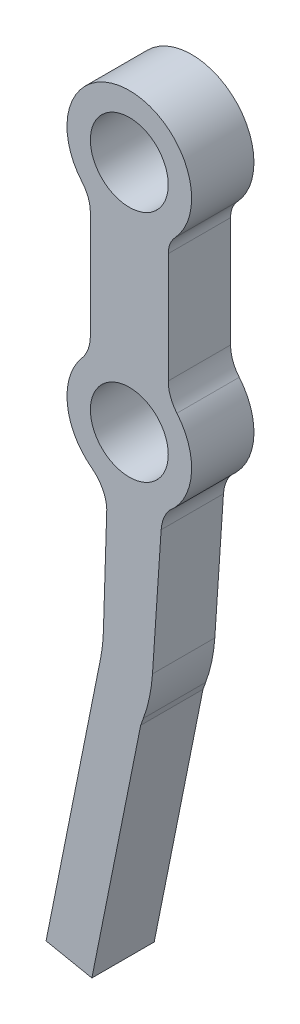
ISO-10303-21;
HEADER;
FILE_DESCRIPTION(('STEP AP214'),'2;1');
FILE_NAME('part.step','',(''),(''),'','','');
FILE_SCHEMA(('AUTOMOTIVE_DESIGN { 1 0 10303 214 1 1 1 1 }'));
ENDSEC;
DATA;
#1=APPLICATION_CONTEXT('core data for automotive mechanical design processes');
#2=APPLICATION_PROTOCOL_DEFINITION('international standard','automotive_design',2000,#1);
#3=PRODUCT_CONTEXT('',#1,'mechanical');
#4=PRODUCT('Part','Part','',(#3));
#5=PRODUCT_RELATED_PRODUCT_CATEGORY('part','',(#4));
#6=PRODUCT_DEFINITION_FORMATION('','',#4);
#7=PRODUCT_DEFINITION_CONTEXT('part definition',#1,'design');
#8=PRODUCT_DEFINITION('design','',#6,#7);
#9=PRODUCT_DEFINITION_SHAPE('','',#8);
#10=(LENGTH_UNIT() NAMED_UNIT(*) SI_UNIT(.MILLI.,.METRE.));
#11=(NAMED_UNIT(*) PLANE_ANGLE_UNIT() SI_UNIT($,.RADIAN.));
#12=(NAMED_UNIT(*) SI_UNIT($,.STERADIAN.) SOLID_ANGLE_UNIT());
#13=UNCERTAINTY_MEASURE_WITH_UNIT(LENGTH_MEASURE(1.E-05),#10,'distance_accuracy_value','');
#14=(GEOMETRIC_REPRESENTATION_CONTEXT(3) GLOBAL_UNCERTAINTY_ASSIGNED_CONTEXT((#13)) GLOBAL_UNIT_ASSIGNED_CONTEXT((#10,
#11,#12)) REPRESENTATION_CONTEXT('',''));
#15=CARTESIAN_POINT('',(0.,0.,0.));
#16=DIRECTION('',(0.,0.,1.));
#17=DIRECTION('',(1.,0.,0.));
#18=AXIS2_PLACEMENT_3D('',#15,#16,#17);
#19=CARTESIAN_POINT('',(-8.48995622355901,-11.7869455782751,4.));
#20=DIRECTION('',(0.,0.,-1.));
#21=DIRECTION('',(-1.,0.,0.));
#22=AXIS2_PLACEMENT_3D('',#19,#20,#21);
#23=PLANE('',#22);
#24=CARTESIAN_POINT('',(-8.48995622355901,-11.7869455782751,4.));
#25=DIRECTION('',(0.,0.,1.));
#26=DIRECTION('',(-1.,0.,0.));
#27=AXIS2_PLACEMENT_3D('',#24,#25,#26);
#28=CIRCLE('',#27,9.99999999999999);
#29=CARTESIAN_POINT('',(0.903082998608848,-15.2178075939814,4.));
#30=VERTEX_POINT('',#29);
#31=CARTESIAN_POINT('',(1.48766526007078,-12.4555781600487,4.));
#32=VERTEX_POINT('',#31);
#33=EDGE_CURVE('E235',#30,#32,#28,.T.);
#34=ORIENTED_EDGE('',*,*,#33,.T.);
#35=DIRECTION('',(0.0668632581773565,0.997762148362979,0.));
#36=VECTOR('',#35,1.);
#37=CARTESIAN_POINT('',(1.48766526007078,-12.4555781600487,4.));
#38=LINE('',#37,#36);
#39=CARTESIAN_POINT('',(2.04316058559065,-4.16623922406479,4.));
#40=VERTEX_POINT('',#39);
#41=EDGE_CURVE('E128',#32,#40,#38,.T.);
#42=ORIENTED_EDGE('',*,*,#41,.T.);
#43=CARTESIAN_POINT('',(4.4377897416618,-4.32671104369044,4.));
#44=DIRECTION('',(0.,0.,-1.));
#45=DIRECTION('',(1.,0.,0.));
#46=AXIS2_PLACEMENT_3D('',#43,#44,#45);
#47=CIRCLE('',#46,2.4);
#48=CARTESIAN_POINT('',(2.54545454545455,-2.8505445540304,4.));
#49=VERTEX_POINT('',#48);
#50=EDGE_CURVE('E283',#40,#49,#47,.T.);
#51=ORIENTED_EDGE('',*,*,#50,.T.);
#52=CARTESIAN_POINT('',(0.,0.235012309329079,4.));
#53=DIRECTION('',(0.,0.,1.));
#54=DIRECTION('',(1.,0.,0.));
#55=AXIS2_PLACEMENT_3D('',#52,#53,#54);
#56=CIRCLE('',#55,4.);
#57=CARTESIAN_POINT('',(3.05546146000932,2.81651483041979,4.));
#58=VERTEX_POINT('',#57);
#59=EDGE_CURVE('E302',#49,#58,#56,.T.);
#60=ORIENTED_EDGE('',*,*,#59,.T.);
#61=CARTESIAN_POINT('',(4.85230829232147,4.3346372771724,4.));
#62=DIRECTION('',(0.,0.,-1.));
#63=DIRECTION('',(1.,0.,0.));
#64=AXIS2_PLACEMENT_3D('',#61,#62,#63);
#65=CIRCLE('',#64,2.35230829232147);
#66=CARTESIAN_POINT('',(2.5,4.3346372771724,4.));
#67=VERTEX_POINT('',#66);
#68=EDGE_CURVE('E299',#58,#67,#65,.T.);
#69=ORIENTED_EDGE('',*,*,#68,.T.);
#70=DIRECTION('',(0.,1.,0.));
#71=VECTOR('',#70,1.);
#72=CARTESIAN_POINT('',(2.5,4.3346372771724,4.));
#73=LINE('',#72,#71);
#74=CARTESIAN_POINT('',(2.5,11.4117547559689,4.));
#75=VERTEX_POINT('',#74);
#76=EDGE_CURVE('E301',#67,#75,#73,.T.);
#77=ORIENTED_EDGE('',*,*,#76,.T.);
#78=CARTESIAN_POINT('',(4.12243277310859,11.4117547559689,4.));
#79=DIRECTION('',(0.,0.,-1.));
#80=DIRECTION('',(1.,0.,0.));
#81=AXIS2_PLACEMENT_3D('',#78,#79,#80);
#82=CIRCLE('',#81,1.62243277310858);
#83=CARTESIAN_POINT('',(2.9328462887636,12.5150099846085,4.));
#84=VERTEX_POINT('',#83);
#85=EDGE_CURVE('E304',#75,#84,#82,.T.);
#86=ORIENTED_EDGE('',*,*,#85,.T.);
#87=CARTESIAN_POINT('',(0.,15.2350123093291,4.));
#88=DIRECTION('',(0.,0.,1.));
#89=DIRECTION('',(1.,0.,0.));
#90=AXIS2_PLACEMENT_3D('',#87,#88,#89);
#91=CIRCLE('',#90,4.);
#92=CARTESIAN_POINT('',(-3.03128037018006,12.6251580380409,4.));
#93=VERTEX_POINT('',#92);
#94=EDGE_CURVE('E310',#84,#93,#91,.T.);
#95=ORIENTED_EDGE('',*,*,#94,.T.);
#96=CARTESIAN_POINT('',(-4.69374256007926,11.1938209404085,4.));
#97=DIRECTION('',(0.,0.,-1.));
#98=DIRECTION('',(1.,0.,0.));
#99=AXIS2_PLACEMENT_3D('',#96,#97,#98);
#100=CIRCLE('',#99,2.19374256007926);
#101=CARTESIAN_POINT('',(-2.5,11.1938209404085,4.));
#102=VERTEX_POINT('',#101);
#103=EDGE_CURVE('E312',#93,#102,#100,.T.);
#104=ORIENTED_EDGE('',*,*,#103,.T.);
#105=DIRECTION('',(0.,-1.,0.));
#106=VECTOR('',#105,1.);
#107=CARTESIAN_POINT('',(-2.5,11.1938209404085,4.));
#108=LINE('',#107,#106);
#109=CARTESIAN_POINT('',(-2.5,4.33791694549141,4.));
#110=VERTEX_POINT('',#109);
#111=EDGE_CURVE('E314',#102,#110,#108,.T.);
#112=ORIENTED_EDGE('',*,*,#111,.T.);
#113=CARTESIAN_POINT('',(-4.86127548448079,4.33791694549141,4.));
#114=DIRECTION('',(0.,0.,-1.));
#115=DIRECTION('',(1.,0.,0.));
#116=AXIS2_PLACEMENT_3D('',#113,#114,#115);
#117=CIRCLE('',#116,2.36127548448079);
#118=CARTESIAN_POINT('',(-3.0567929317575,2.8149380780979,4.));
#119=VERTEX_POINT('',#118);
#120=EDGE_CURVE('E316',#110,#119,#117,.T.);
#121=ORIENTED_EDGE('',*,*,#120,.T.);
#122=CARTESIAN_POINT('',(0.,0.235012309329079,4.));
#123=DIRECTION('',(0.,0.,1.));
#124=DIRECTION('',(1.,0.,0.));
#125=AXIS2_PLACEMENT_3D('',#122,#123,#124);
#126=CIRCLE('',#125,4.);
#127=CARTESIAN_POINT('',(-2.40187960840345,-2.96357712145689,4.));
#128=VERTEX_POINT('',#127);
#129=EDGE_CURVE('E318',#119,#128,#126,.T.);
#130=ORIENTED_EDGE('',*,*,#129,.T.);
#131=CARTESIAN_POINT('',(-3.84300737344553,-4.88273077992848,4.));
#132=DIRECTION('',(0.,0.,-1.));
#133=DIRECTION('',(1.,0.,0.));
#134=AXIS2_PLACEMENT_3D('',#131,#132,#133);
#135=CIRCLE('',#134,2.40000000000002);
#136=CARTESIAN_POINT('',(-1.44551163273416,-4.77312159568338,4.));
#137=VERTEX_POINT('',#136);
#138=EDGE_CURVE('E320',#128,#137,#135,.T.);
#139=ORIENTED_EDGE('',*,*,#138,.T.);
#140=DIRECTION('',(-0.0315811434642238,-0.999501191283678,0.));
#141=VECTOR('',#140,1.);
#142=CARTESIAN_POINT('',(-1.44551163273415,-4.77312159568338,4.));
#143=LINE('',#142,#141);
#144=CARTESIAN_POINT('',(-1.66323997116042,-11.6639339527406,4.));
#145=VERTEX_POINT('',#144);
#146=EDGE_CURVE('E322',#137,#145,#143,.T.);
#147=ORIENTED_EDGE('',*,*,#146,.T.);
#148=CARTESIAN_POINT('',(-11.6582518839972,-11.3481225180983,4.));
#149=DIRECTION('',(0.,0.,-1.));
#150=DIRECTION('',(-1.,0.,0.));
#151=AXIS2_PLACEMENT_3D('',#148,#149,#150);
#152=CIRCLE('',#151,10.);
#153=CARTESIAN_POINT('',(-1.8535012837231,-13.3145572783751,4.));
#154=VERTEX_POINT('',#153);
#155=EDGE_CURVE('E324',#145,#154,#152,.T.);
#156=ORIENTED_EDGE('',*,*,#155,.T.);
#157=DIRECTION('',(-0.196643476027674,-0.98047506002741,0.));
#158=VECTOR('',#157,1.);
#159=CARTESIAN_POINT('',(-1.8535012837231,-13.3145572783751,4.));
#160=LINE('',#159,#158);
#161=CARTESIAN_POINT('',(-5.34330478848568,-30.7149072413427,4.));
#162=VERTEX_POINT('',#161);
#163=EDGE_CURVE('E180',#154,#162,#160,.T.);
#164=ORIENTED_EDGE('',*,*,#163,.T.);
#165=DIRECTION('',(0.98047506002741,-0.196643476027674,0.));
#166=VECTOR('',#165,1.);
#167=CARTESIAN_POINT('',(-5.34330478848568,-30.7149072413427,4.));
#168=LINE('',#167,#166);
#169=CARTESIAN_POINT('',(-2.40187960840345,-31.3048376694257,4.));
#170=VERTEX_POINT('',#169);
#171=EDGE_CURVE('E174',#162,#170,#168,.T.);
#172=ORIENTED_EDGE('',*,*,#171,.T.);
#173=DIRECTION('',(0.196643476027674,0.98047506002741,0.));
#174=VECTOR('',#173,1.);
#175=CARTESIAN_POINT('',(-2.40187960840345,-31.3048376694257,4.));
#176=LINE('',#175,#174);
#177=CARTESIAN_POINT('',(0.728861428484565,-15.6947926881162,4.));
#178=VERTEX_POINT('',#177);
#179=EDGE_CURVE('E178',#170,#178,#176,.T.);
#180=ORIENTED_EDGE('',*,*,#179,.T.);
#181=DIRECTION('',(0.343086201570629,0.939303922216786,0.));
#182=VECTOR('',#181,1.);
#183=CARTESIAN_POINT('',(0.903082998608848,-15.2178075939814,4.));
#184=LINE('',#183,#182);
#185=EDGE_CURVE('E52',#178,#30,#184,.T.);
#186=ORIENTED_EDGE('',*,*,#185,.T.);
#187=EDGE_LOOP('',(#34,#42,#51,#60,#69,#77,#86,#95,#104,#112,#121,#130,#139,#147,#156,#164,#172,
#180,#186));
#188=FACE_BOUND('',#187,.T.);
#189=CARTESIAN_POINT('',(0.,0.235012309329079,4.));
#190=DIRECTION('',(0.,0.,1.));
#191=DIRECTION('',(1.,0.,0.));
#192=AXIS2_PLACEMENT_3D('',#189,#190,#191);
#193=CIRCLE('',#192,2.5);
#194=CARTESIAN_POINT('',(2.5,0.235012309329079,4.));
#195=VERTEX_POINT('',#194);
#196=EDGE_CURVE('E202',#195,#195,#193,.T.);
#197=ORIENTED_EDGE('',*,*,#196,.F.);
#198=EDGE_LOOP('',(#197));
#199=FACE_BOUND('',#198,.T.);
#200=CARTESIAN_POINT('',(0.,15.2350123093291,4.));
#201=DIRECTION('',(0.,0.,1.));
#202=DIRECTION('',(1.,0.,0.));
#203=AXIS2_PLACEMENT_3D('',#200,#201,#202);
#204=CIRCLE('',#203,2.5);
#205=CARTESIAN_POINT('',(2.5,15.2350123093291,4.));
#206=VERTEX_POINT('',#205);
#207=EDGE_CURVE('E365',#206,#206,#204,.T.);
#208=ORIENTED_EDGE('',*,*,#207,.F.);
#209=EDGE_LOOP('',(#208));
#210=FACE_BOUND('',#209,.T.);
#211=ADVANCED_FACE('F35',(#188,#199,#210),#23,.F.);
#212=CARTESIAN_POINT('',(-8.48995622355901,-11.7869455782751,0.));
#213=DIRECTION('',(0.,0.,-1.));
#214=DIRECTION('',(-1.,0.,0.));
#215=AXIS2_PLACEMENT_3D('',#212,#213,#214);
#216=PLANE('',#215);
#217=CARTESIAN_POINT('',(0.,0.235012309329079,0.));
#218=DIRECTION('',(0.,0.,1.));
#219=DIRECTION('',(1.,0.,0.));
#220=AXIS2_PLACEMENT_3D('',#217,#218,#219);
#221=CIRCLE('',#220,2.5);
#222=CARTESIAN_POINT('',(2.5,0.235012309329079,0.));
#223=VERTEX_POINT('',#222);
#224=EDGE_CURVE('E370',#223,#223,#221,.T.);
#225=ORIENTED_EDGE('',*,*,#224,.T.);
#226=EDGE_LOOP('',(#225));
#227=FACE_BOUND('',#226,.T.);
#228=CARTESIAN_POINT('',(-8.48995622355901,-11.7869455782751,0.));
#229=DIRECTION('',(0.,0.,1.));
#230=DIRECTION('',(-1.,0.,0.));
#231=AXIS2_PLACEMENT_3D('',#228,#229,#230);
#232=CIRCLE('',#231,9.99999999999999);
#233=CARTESIAN_POINT('',(0.903082998608848,-15.2178075939814,0.));
#234=VERTEX_POINT('',#233);
#235=CARTESIAN_POINT('',(1.48766526007078,-12.4555781600487,0.));
#236=VERTEX_POINT('',#235);
#237=EDGE_CURVE('E198',#234,#236,#232,.T.);
#238=ORIENTED_EDGE('',*,*,#237,.F.);
#239=DIRECTION('',(0.343086201570629,0.939303922216786,0.));
#240=VECTOR('',#239,1.);
#241=CARTESIAN_POINT('',(0.903082998608848,-15.2178075939814,0.));
#242=LINE('',#241,#240);
#243=CARTESIAN_POINT('',(0.728861428484565,-15.6947926881162,0.));
#244=VERTEX_POINT('',#243);
#245=EDGE_CURVE('E120',#244,#234,#242,.T.);
#246=ORIENTED_EDGE('',*,*,#245,.F.);
#247=DIRECTION('',(0.196643476027674,0.98047506002741,0.));
#248=VECTOR('',#247,1.);
#249=CARTESIAN_POINT('',(-2.40187960840345,-31.3048376694257,0.));
#250=LINE('',#249,#248);
#251=CARTESIAN_POINT('',(-2.40187960840345,-31.3048376694257,0.));
#252=VERTEX_POINT('',#251);
#253=EDGE_CURVE('E114',#252,#244,#250,.T.);
#254=ORIENTED_EDGE('',*,*,#253,.F.);
#255=DIRECTION('',(0.98047506002741,-0.196643476027674,0.));
#256=VECTOR('',#255,1.);
#257=CARTESIAN_POINT('',(-5.34330478848568,-30.7149072413427,0.));
#258=LINE('',#257,#256);
#259=CARTESIAN_POINT('',(-5.34330478848568,-30.7149072413427,0.));
#260=VERTEX_POINT('',#259);
#261=EDGE_CURVE('E188',#260,#252,#258,.T.);
#262=ORIENTED_EDGE('',*,*,#261,.F.);
#263=DIRECTION('',(-0.196643476027674,-0.98047506002741,0.));
#264=VECTOR('',#263,1.);
#265=CARTESIAN_POINT('',(-1.8535012837231,-13.3145572783751,0.));
#266=LINE('',#265,#264);
#267=CARTESIAN_POINT('',(-1.8535012837231,-13.3145572783751,0.));
#268=VERTEX_POINT('',#267);
#269=EDGE_CURVE('E230',#268,#260,#266,.T.);
#270=ORIENTED_EDGE('',*,*,#269,.F.);
#271=CARTESIAN_POINT('',(-11.6582518839972,-11.3481225180983,0.));
#272=DIRECTION('',(0.,0.,-1.));
#273=DIRECTION('',(-1.,0.,0.));
#274=AXIS2_PLACEMENT_3D('',#271,#272,#273);
#275=CIRCLE('',#274,10.);
#276=CARTESIAN_POINT('',(-1.66323997116042,-11.6639339527406,0.));
#277=VERTEX_POINT('',#276);
#278=EDGE_CURVE('E228',#277,#268,#275,.T.);
#279=ORIENTED_EDGE('',*,*,#278,.F.);
#280=DIRECTION('',(-0.0315811434642238,-0.999501191283678,0.));
#281=VECTOR('',#280,1.);
#282=CARTESIAN_POINT('',(-1.44551163273415,-4.77312159568338,0.));
#283=LINE('',#282,#281);
#284=CARTESIAN_POINT('',(-1.44551163273416,-4.77312159568338,0.));
#285=VERTEX_POINT('',#284);
#286=EDGE_CURVE('E226',#285,#277,#283,.T.);
#287=ORIENTED_EDGE('',*,*,#286,.F.);
#288=CARTESIAN_POINT('',(-3.84300737344553,-4.88273077992848,0.));
#289=DIRECTION('',(0.,0.,-1.));
#290=DIRECTION('',(1.,0.,0.));
#291=AXIS2_PLACEMENT_3D('',#288,#289,#290);
#292=CIRCLE('',#291,2.40000000000002);
#293=CARTESIAN_POINT('',(-2.40187960840345,-2.96357712145689,0.));
#294=VERTEX_POINT('',#293);
#295=EDGE_CURVE('E224',#294,#285,#292,.T.);
#296=ORIENTED_EDGE('',*,*,#295,.F.);
#297=CARTESIAN_POINT('',(0.,0.235012309329079,0.));
#298=DIRECTION('',(0.,0.,1.));
#299=DIRECTION('',(1.,0.,0.));
#300=AXIS2_PLACEMENT_3D('',#297,#298,#299);
#301=CIRCLE('',#300,4.);
#302=CARTESIAN_POINT('',(-3.0567929317575,2.8149380780979,0.));
#303=VERTEX_POINT('',#302);
#304=EDGE_CURVE('E222',#303,#294,#301,.T.);
#305=ORIENTED_EDGE('',*,*,#304,.F.);
#306=CARTESIAN_POINT('',(-4.86127548448079,4.33791694549141,0.));
#307=DIRECTION('',(0.,0.,-1.));
#308=DIRECTION('',(1.,0.,0.));
#309=AXIS2_PLACEMENT_3D('',#306,#307,#308);
#310=CIRCLE('',#309,2.36127548448079);
#311=CARTESIAN_POINT('',(-2.5,4.33791694549141,0.));
#312=VERTEX_POINT('',#311);
#313=EDGE_CURVE('E220',#312,#303,#310,.T.);
#314=ORIENTED_EDGE('',*,*,#313,.F.);
#315=DIRECTION('',(0.,-1.,0.));
#316=VECTOR('',#315,1.);
#317=CARTESIAN_POINT('',(-2.5,11.1938209404085,0.));
#318=LINE('',#317,#316);
#319=CARTESIAN_POINT('',(-2.5,11.1938209404085,0.));
#320=VERTEX_POINT('',#319);
#321=EDGE_CURVE('E218',#320,#312,#318,.T.);
#322=ORIENTED_EDGE('',*,*,#321,.F.);
#323=CARTESIAN_POINT('',(-4.69374256007926,11.1938209404085,0.));
#324=DIRECTION('',(0.,0.,-1.));
#325=DIRECTION('',(1.,0.,0.));
#326=AXIS2_PLACEMENT_3D('',#323,#324,#325);
#327=CIRCLE('',#326,2.19374256007926);
#328=CARTESIAN_POINT('',(-3.03128037018006,12.6251580380409,0.));
#329=VERTEX_POINT('',#328);
#330=EDGE_CURVE('E216',#329,#320,#327,.T.);
#331=ORIENTED_EDGE('',*,*,#330,.F.);
#332=CARTESIAN_POINT('',(0.,15.2350123093291,0.));
#333=DIRECTION('',(0.,0.,1.));
#334=DIRECTION('',(1.,0.,0.));
#335=AXIS2_PLACEMENT_3D('',#332,#333,#334);
#336=CIRCLE('',#335,4.);
#337=CARTESIAN_POINT('',(2.9328462887636,12.5150099846085,0.));
#338=VERTEX_POINT('',#337);
#339=EDGE_CURVE('E214',#338,#329,#336,.T.);
#340=ORIENTED_EDGE('',*,*,#339,.F.);
#341=CARTESIAN_POINT('',(4.12243277310859,11.4117547559689,0.));
#342=DIRECTION('',(0.,0.,-1.));
#343=DIRECTION('',(1.,0.,0.));
#344=AXIS2_PLACEMENT_3D('',#341,#342,#343);
#345=CIRCLE('',#344,1.62243277310858);
#346=CARTESIAN_POINT('',(2.5,11.4117547559689,0.));
#347=VERTEX_POINT('',#346);
#348=EDGE_CURVE('E212',#347,#338,#345,.T.);
#349=ORIENTED_EDGE('',*,*,#348,.F.);
#350=DIRECTION('',(0.,1.,0.));
#351=VECTOR('',#350,1.);
#352=CARTESIAN_POINT('',(2.5,4.3346372771724,0.));
#353=LINE('',#352,#351);
#354=CARTESIAN_POINT('',(2.5,4.3346372771724,0.));
#355=VERTEX_POINT('',#354);
#356=EDGE_CURVE('E210',#355,#347,#353,.T.);
#357=ORIENTED_EDGE('',*,*,#356,.F.);
#358=CARTESIAN_POINT('',(4.85230829232147,4.3346372771724,0.));
#359=DIRECTION('',(0.,0.,-1.));
#360=DIRECTION('',(1.,0.,0.));
#361=AXIS2_PLACEMENT_3D('',#358,#359,#360);
#362=CIRCLE('',#361,2.35230829232147);
#363=CARTESIAN_POINT('',(3.05546146000932,2.81651483041979,0.));
#364=VERTEX_POINT('',#363);
#365=EDGE_CURVE('E208',#364,#355,#362,.T.);
#366=ORIENTED_EDGE('',*,*,#365,.F.);
#367=CARTESIAN_POINT('',(0.,0.235012309329079,0.));
#368=DIRECTION('',(0.,0.,1.));
#369=DIRECTION('',(1.,0.,0.));
#370=AXIS2_PLACEMENT_3D('',#367,#368,#369);
#371=CIRCLE('',#370,4.);
#372=CARTESIAN_POINT('',(2.54545454545455,-2.8505445540304,0.));
#373=VERTEX_POINT('',#372);
#374=EDGE_CURVE('E206',#373,#364,#371,.T.);
#375=ORIENTED_EDGE('',*,*,#374,.F.);
#376=CARTESIAN_POINT('',(4.4377897416618,-4.32671104369044,0.));
#377=DIRECTION('',(0.,0.,-1.));
#378=DIRECTION('',(1.,0.,0.));
#379=AXIS2_PLACEMENT_3D('',#376,#377,#378);
#380=CIRCLE('',#379,2.4);
#381=CARTESIAN_POINT('',(2.04316058559065,-4.16623922406479,0.));
#382=VERTEX_POINT('',#381);
#383=EDGE_CURVE('E204',#382,#373,#380,.T.);
#384=ORIENTED_EDGE('',*,*,#383,.F.);
#385=DIRECTION('',(0.0668632581773565,0.997762148362979,0.));
#386=VECTOR('',#385,1.);
#387=CARTESIAN_POINT('',(1.48766526007078,-12.4555781600487,0.));
#388=LINE('',#387,#386);
#389=EDGE_CURVE('E201',#236,#382,#388,.T.);
#390=ORIENTED_EDGE('',*,*,#389,.F.);
#391=EDGE_LOOP('',(#238,#246,#254,#262,#270,#279,#287,#296,#305,#314,#322,#331,#340,#349,#357,
#366,#375,#384,#390));
#392=FACE_BOUND('',#391,.T.);
#393=CARTESIAN_POINT('',(0.,15.2350123093291,0.));
#394=DIRECTION('',(0.,0.,1.));
#395=DIRECTION('',(1.,0.,0.));
#396=AXIS2_PLACEMENT_3D('',#393,#394,#395);
#397=CIRCLE('',#396,2.5);
#398=CARTESIAN_POINT('',(2.5,15.2350123093291,0.));
#399=VERTEX_POINT('',#398);
#400=EDGE_CURVE('E368',#399,#399,#397,.T.);
#401=ORIENTED_EDGE('',*,*,#400,.T.);
#402=EDGE_LOOP('',(#401));
#403=FACE_BOUND('',#402,.T.);
#404=ADVANCED_FACE('F287',(#227,#392,#403),#216,.T.);
#405=CARTESIAN_POINT('',(-8.48995622355901,-11.7869455782751,4.));
#406=DIRECTION('',(0.,0.,-1.));
#407=DIRECTION('',(-1.,0.,0.));
#408=AXIS2_PLACEMENT_3D('',#405,#406,#407);
#409=CYLINDRICAL_SURFACE('',#408,9.99999999999999);
#410=ORIENTED_EDGE('',*,*,#237,.T.);
#411=DIRECTION('',(0.,0.,-1.));
#412=VECTOR('',#411,1.);
#413=CARTESIAN_POINT('',(1.48766526007078,-12.4555781600487,4.));
#414=LINE('',#413,#412);
#415=EDGE_CURVE('E11',#32,#236,#414,.T.);
#416=ORIENTED_EDGE('',*,*,#415,.F.);
#417=ORIENTED_EDGE('',*,*,#33,.F.);
#418=DIRECTION('',(0.,0.,-1.));
#419=VECTOR('',#418,1.);
#420=CARTESIAN_POINT('',(0.903082998608848,-15.2178075939814,4.));
#421=LINE('',#420,#419);
#422=EDGE_CURVE('E194',#30,#234,#421,.T.);
#423=ORIENTED_EDGE('',*,*,#422,.T.);
#424=EDGE_LOOP('',(#410,#416,#417,#423));
#425=FACE_BOUND('',#424,.T.);
#426=ADVANCED_FACE('F37',(#425),#409,.T.);
#427=CARTESIAN_POINT('',(1.48766526007078,-12.4555781600487,4.));
#428=DIRECTION('',(-0.99776214836298,0.0668632581773566,0.));
#429=DIRECTION('',(-0.0668632581773565,-0.997762148362979,0.));
#430=AXIS2_PLACEMENT_3D('',#427,#428,#429);
#431=PLANE('',#430);
#432=ORIENTED_EDGE('',*,*,#389,.T.);
#433=DIRECTION('',(0.,0.,-1.));
#434=VECTOR('',#433,1.);
#435=CARTESIAN_POINT('',(2.04316058559065,-4.16623922406479,4.));
#436=LINE('',#435,#434);
#437=EDGE_CURVE('E44',#40,#382,#436,.T.);
#438=ORIENTED_EDGE('',*,*,#437,.F.);
#439=ORIENTED_EDGE('',*,*,#41,.F.);
#440=ORIENTED_EDGE('',*,*,#415,.T.);
#441=EDGE_LOOP('',(#432,#438,#439,#440));
#442=FACE_BOUND('',#441,.T.);
#443=ADVANCED_FACE('F535',(#442),#431,.F.);
#444=CARTESIAN_POINT('',(4.4377897416618,-4.32671104369044,4.));
#445=DIRECTION('',(0.,0.,-1.));
#446=DIRECTION('',(-1.,0.,0.));
#447=AXIS2_PLACEMENT_3D('',#444,#445,#446);
#448=CYLINDRICAL_SURFACE('',#447,2.4);
#449=ORIENTED_EDGE('',*,*,#383,.T.);
#450=DIRECTION('',(0.,0.,-1.));
#451=VECTOR('',#450,1.);
#452=CARTESIAN_POINT('',(2.54545454545455,-2.8505445540304,4.));
#453=LINE('',#452,#451);
#454=EDGE_CURVE('E275',#49,#373,#453,.T.);
#455=ORIENTED_EDGE('',*,*,#454,.F.);
#456=ORIENTED_EDGE('',*,*,#50,.F.);
#457=ORIENTED_EDGE('',*,*,#437,.T.);
#458=EDGE_LOOP('',(#449,#455,#456,#457));
#459=FACE_BOUND('',#458,.T.);
#460=ADVANCED_FACE('F281',(#459),#448,.F.);
#461=CARTESIAN_POINT('',(0.,0.235012309329079,4.));
#462=DIRECTION('',(0.,0.,-1.));
#463=DIRECTION('',(-1.,0.,0.));
#464=AXIS2_PLACEMENT_3D('',#461,#462,#463);
#465=CYLINDRICAL_SURFACE('',#464,4.);
#466=ORIENTED_EDGE('',*,*,#374,.T.);
#467=DIRECTION('',(0.,0.,-1.));
#468=VECTOR('',#467,1.);
#469=CARTESIAN_POINT('',(3.05546146000932,2.81651483041979,4.));
#470=LINE('',#469,#468);
#471=EDGE_CURVE('E272',#58,#364,#470,.T.);
#472=ORIENTED_EDGE('',*,*,#471,.F.);
#473=ORIENTED_EDGE('',*,*,#59,.F.);
#474=ORIENTED_EDGE('',*,*,#454,.T.);
#475=EDGE_LOOP('',(#466,#472,#473,#474));
#476=FACE_BOUND('',#475,.T.);
#477=ADVANCED_FACE('F293',(#476),#465,.T.);
#478=CARTESIAN_POINT('',(4.85230829232147,4.3346372771724,4.));
#479=DIRECTION('',(0.,0.,-1.));
#480=DIRECTION('',(-1.,0.,0.));
#481=AXIS2_PLACEMENT_3D('',#478,#479,#480);
#482=CYLINDRICAL_SURFACE('',#481,2.35230829232147);
#483=ORIENTED_EDGE('',*,*,#365,.T.);
#484=DIRECTION('',(0.,0.,-1.));
#485=VECTOR('',#484,1.);
#486=CARTESIAN_POINT('',(2.5,4.3346372771724,4.));
#487=LINE('',#486,#485);
#488=EDGE_CURVE('E269',#67,#355,#487,.T.);
#489=ORIENTED_EDGE('',*,*,#488,.F.);
#490=ORIENTED_EDGE('',*,*,#68,.F.);
#491=ORIENTED_EDGE('',*,*,#471,.T.);
#492=EDGE_LOOP('',(#483,#489,#490,#491));
#493=FACE_BOUND('',#492,.T.);
#494=ADVANCED_FACE('F297',(#493),#482,.F.);
#495=CARTESIAN_POINT('',(2.5,4.3346372771724,4.));
#496=DIRECTION('',(-1.,0.,0.));
#497=DIRECTION('',(0.,-1.,0.));
#498=AXIS2_PLACEMENT_3D('',#495,#496,#497);
#499=PLANE('',#498);
#500=ORIENTED_EDGE('',*,*,#356,.T.);
#501=DIRECTION('',(0.,0.,-1.));
#502=VECTOR('',#501,1.);
#503=CARTESIAN_POINT('',(2.5,11.4117547559689,4.));
#504=LINE('',#503,#502);
#505=EDGE_CURVE('E266',#75,#347,#504,.T.);
#506=ORIENTED_EDGE('',*,*,#505,.F.);
#507=ORIENTED_EDGE('',*,*,#76,.F.);
#508=ORIENTED_EDGE('',*,*,#488,.T.);
#509=EDGE_LOOP('',(#500,#506,#507,#508));
#510=FACE_BOUND('',#509,.T.);
#511=ADVANCED_FACE('F500',(#510),#499,.F.);
#512=CARTESIAN_POINT('',(4.12243277310859,11.4117547559689,4.));
#513=DIRECTION('',(0.,0.,-1.));
#514=DIRECTION('',(-1.,0.,0.));
#515=AXIS2_PLACEMENT_3D('',#512,#513,#514);
#516=CYLINDRICAL_SURFACE('',#515,1.62243277310858);
#517=ORIENTED_EDGE('',*,*,#348,.T.);
#518=DIRECTION('',(0.,0.,-1.));
#519=VECTOR('',#518,1.);
#520=CARTESIAN_POINT('',(2.9328462887636,12.5150099846085,4.));
#521=LINE('',#520,#519);
#522=EDGE_CURVE('E263',#84,#338,#521,.T.);
#523=ORIENTED_EDGE('',*,*,#522,.F.);
#524=ORIENTED_EDGE('',*,*,#85,.F.);
#525=ORIENTED_EDGE('',*,*,#505,.T.);
#526=EDGE_LOOP('',(#517,#523,#524,#525));
#527=FACE_BOUND('',#526,.T.);
#528=ADVANCED_FACE('F490',(#527),#516,.F.);
#529=CARTESIAN_POINT('',(0.,15.2350123093291,4.));
#530=DIRECTION('',(0.,0.,-1.));
#531=DIRECTION('',(-1.,0.,0.));
#532=AXIS2_PLACEMENT_3D('',#529,#530,#531);
#533=CYLINDRICAL_SURFACE('',#532,4.);
#534=ORIENTED_EDGE('',*,*,#339,.T.);
#535=DIRECTION('',(0.,0.,-1.));
#536=VECTOR('',#535,1.);
#537=CARTESIAN_POINT('',(-3.03128037018006,12.6251580380409,4.));
#538=LINE('',#537,#536);
#539=EDGE_CURVE('E260',#93,#329,#538,.T.);
#540=ORIENTED_EDGE('',*,*,#539,.F.);
#541=ORIENTED_EDGE('',*,*,#94,.F.);
#542=ORIENTED_EDGE('',*,*,#522,.T.);
#543=EDGE_LOOP('',(#534,#540,#541,#542));
#544=FACE_BOUND('',#543,.T.);
#545=ADVANCED_FACE('F480',(#544),#533,.T.);
#546=CARTESIAN_POINT('',(-4.69374256007926,11.1938209404085,4.));
#547=DIRECTION('',(0.,0.,-1.));
#548=DIRECTION('',(-1.,0.,0.));
#549=AXIS2_PLACEMENT_3D('',#546,#547,#548);
#550=CYLINDRICAL_SURFACE('',#549,2.19374256007926);
#551=ORIENTED_EDGE('',*,*,#330,.T.);
#552=DIRECTION('',(0.,0.,-1.));
#553=VECTOR('',#552,1.);
#554=CARTESIAN_POINT('',(-2.5,11.1938209404085,4.));
#555=LINE('',#554,#553);
#556=EDGE_CURVE('E257',#102,#320,#555,.T.);
#557=ORIENTED_EDGE('',*,*,#556,.F.);
#558=ORIENTED_EDGE('',*,*,#103,.F.);
#559=ORIENTED_EDGE('',*,*,#539,.T.);
#560=EDGE_LOOP('',(#551,#557,#558,#559));
#561=FACE_BOUND('',#560,.T.);
#562=ADVANCED_FACE('F470',(#561),#550,.F.);
#563=CARTESIAN_POINT('',(-2.5,11.1938209404085,4.));
#564=DIRECTION('',(1.,0.,0.));
#565=DIRECTION('',(0.,1.,0.));
#566=AXIS2_PLACEMENT_3D('',#563,#564,#565);
#567=PLANE('',#566);
#568=ORIENTED_EDGE('',*,*,#321,.T.);
#569=DIRECTION('',(0.,0.,-1.));
#570=VECTOR('',#569,1.);
#571=CARTESIAN_POINT('',(-2.5,4.33791694549141,4.));
#572=LINE('',#571,#570);
#573=EDGE_CURVE('E254',#110,#312,#572,.T.);
#574=ORIENTED_EDGE('',*,*,#573,.F.);
#575=ORIENTED_EDGE('',*,*,#111,.F.);
#576=ORIENTED_EDGE('',*,*,#556,.T.);
#577=EDGE_LOOP('',(#568,#574,#575,#576));
#578=FACE_BOUND('',#577,.T.);
#579=ADVANCED_FACE('F460',(#578),#567,.F.);
#580=CARTESIAN_POINT('',(-4.86127548448079,4.33791694549141,4.));
#581=DIRECTION('',(0.,0.,-1.));
#582=DIRECTION('',(-1.,0.,0.));
#583=AXIS2_PLACEMENT_3D('',#580,#581,#582);
#584=CYLINDRICAL_SURFACE('',#583,2.36127548448079);
#585=ORIENTED_EDGE('',*,*,#313,.T.);
#586=DIRECTION('',(0.,0.,-1.));
#587=VECTOR('',#586,1.);
#588=CARTESIAN_POINT('',(-3.0567929317575,2.8149380780979,4.));
#589=LINE('',#588,#587);
#590=EDGE_CURVE('E251',#119,#303,#589,.T.);
#591=ORIENTED_EDGE('',*,*,#590,.F.);
#592=ORIENTED_EDGE('',*,*,#120,.F.);
#593=ORIENTED_EDGE('',*,*,#573,.T.);
#594=EDGE_LOOP('',(#585,#591,#592,#593));
#595=FACE_BOUND('',#594,.T.);
#596=ADVANCED_FACE('F450',(#595),#584,.F.);
#597=CARTESIAN_POINT('',(0.,0.235012309329079,4.));
#598=DIRECTION('',(0.,0.,-1.));
#599=DIRECTION('',(-1.,0.,0.));
#600=AXIS2_PLACEMENT_3D('',#597,#598,#599);
#601=CYLINDRICAL_SURFACE('',#600,4.);
#602=ORIENTED_EDGE('',*,*,#304,.T.);
#603=DIRECTION('',(0.,0.,-1.));
#604=VECTOR('',#603,1.);
#605=CARTESIAN_POINT('',(-2.40187960840345,-2.96357712145689,4.));
#606=LINE('',#605,#604);
#607=EDGE_CURVE('E248',#128,#294,#606,.T.);
#608=ORIENTED_EDGE('',*,*,#607,.F.);
#609=ORIENTED_EDGE('',*,*,#129,.F.);
#610=ORIENTED_EDGE('',*,*,#590,.T.);
#611=EDGE_LOOP('',(#602,#608,#609,#610));
#612=FACE_BOUND('',#611,.T.);
#613=ADVANCED_FACE('F440',(#612),#601,.T.);
#614=CARTESIAN_POINT('',(-3.84300737344553,-4.88273077992848,4.));
#615=DIRECTION('',(0.,0.,-1.));
#616=DIRECTION('',(-1.,0.,0.));
#617=AXIS2_PLACEMENT_3D('',#614,#615,#616);
#618=CYLINDRICAL_SURFACE('',#617,2.40000000000002);
#619=ORIENTED_EDGE('',*,*,#295,.T.);
#620=DIRECTION('',(0.,0.,-1.));
#621=VECTOR('',#620,1.);
#622=CARTESIAN_POINT('',(-1.44551163273416,-4.77312159568338,4.));
#623=LINE('',#622,#621);
#624=EDGE_CURVE('E245',#137,#285,#623,.T.);
#625=ORIENTED_EDGE('',*,*,#624,.F.);
#626=ORIENTED_EDGE('',*,*,#138,.F.);
#627=ORIENTED_EDGE('',*,*,#607,.T.);
#628=EDGE_LOOP('',(#619,#625,#626,#627));
#629=FACE_BOUND('',#628,.T.);
#630=ADVANCED_FACE('F430',(#629),#618,.F.);
#631=CARTESIAN_POINT('',(-1.44551163273415,-4.77312159568338,4.));
#632=DIRECTION('',(0.999501191283678,-0.0315811434642238,0.));
#633=DIRECTION('',(0.0315811434642238,0.999501191283678,0.));
#634=AXIS2_PLACEMENT_3D('',#631,#632,#633);
#635=PLANE('',#634);
#636=ORIENTED_EDGE('',*,*,#286,.T.);
#637=DIRECTION('',(0.,0.,-1.));
#638=VECTOR('',#637,1.);
#639=CARTESIAN_POINT('',(-1.66323997116042,-11.6639339527406,4.));
#640=LINE('',#639,#638);
#641=EDGE_CURVE('E242',#145,#277,#640,.T.);
#642=ORIENTED_EDGE('',*,*,#641,.F.);
#643=ORIENTED_EDGE('',*,*,#146,.F.);
#644=ORIENTED_EDGE('',*,*,#624,.T.);
#645=EDGE_LOOP('',(#636,#642,#643,#644));
#646=FACE_BOUND('',#645,.T.);
#647=ADVANCED_FACE('F421',(#646),#635,.F.);
#648=CARTESIAN_POINT('',(-11.6582518839972,-11.3481225180983,4.));
#649=DIRECTION('',(0.,0.,-1.));
#650=DIRECTION('',(-1.,0.,0.));
#651=AXIS2_PLACEMENT_3D('',#648,#649,#650);
#652=CYLINDRICAL_SURFACE('',#651,10.);
#653=ORIENTED_EDGE('',*,*,#278,.T.);
#654=DIRECTION('',(0.,0.,-1.));
#655=VECTOR('',#654,1.);
#656=CARTESIAN_POINT('',(-1.8535012837231,-13.3145572783751,4.));
#657=LINE('',#656,#655);
#658=EDGE_CURVE('E239',#154,#268,#657,.T.);
#659=ORIENTED_EDGE('',*,*,#658,.F.);
#660=ORIENTED_EDGE('',*,*,#155,.F.);
#661=ORIENTED_EDGE('',*,*,#641,.T.);
#662=EDGE_LOOP('',(#653,#659,#660,#661));
#663=FACE_BOUND('',#662,.T.);
#664=ADVANCED_FACE('F330',(#663),#652,.F.);
#665=CARTESIAN_POINT('',(-1.8535012837231,-13.3145572783751,4.));
#666=DIRECTION('',(0.98047506002741,-0.196643476027674,0.));
#667=DIRECTION('',(0.196643476027674,0.98047506002741,0.));
#668=AXIS2_PLACEMENT_3D('',#665,#666,#667);
#669=PLANE('',#668);
#670=ORIENTED_EDGE('',*,*,#269,.T.);
#671=DIRECTION('',(0.,0.,-1.));
#672=VECTOR('',#671,1.);
#673=CARTESIAN_POINT('',(-5.34330478848568,-30.7149072413427,4.));
#674=LINE('',#673,#672);
#675=EDGE_CURVE('E189',#162,#260,#674,.T.);
#676=ORIENTED_EDGE('',*,*,#675,.F.);
#677=ORIENTED_EDGE('',*,*,#163,.F.);
#678=ORIENTED_EDGE('',*,*,#658,.T.);
#679=EDGE_LOOP('',(#670,#676,#677,#678));
#680=FACE_BOUND('',#679,.T.);
#681=ADVANCED_FACE('F334',(#680),#669,.F.);
#682=CARTESIAN_POINT('',(-5.34330478848568,-30.7149072413427,4.));
#683=DIRECTION('',(0.196643476027674,0.98047506002741,0.));
#684=DIRECTION('',(-0.98047506002741,0.196643476027674,0.));
#685=AXIS2_PLACEMENT_3D('',#682,#683,#684);
#686=PLANE('',#685);
#687=ORIENTED_EDGE('',*,*,#261,.T.);
#688=DIRECTION('',(0.,0.,-1.));
#689=VECTOR('',#688,1.);
#690=CARTESIAN_POINT('',(-2.40187960840345,-31.3048376694257,4.));
#691=LINE('',#690,#689);
#692=EDGE_CURVE('E185',#170,#252,#691,.T.);
#693=ORIENTED_EDGE('',*,*,#692,.F.);
#694=ORIENTED_EDGE('',*,*,#171,.F.);
#695=ORIENTED_EDGE('',*,*,#675,.T.);
#696=EDGE_LOOP('',(#687,#693,#694,#695));
#697=FACE_BOUND('',#696,.T.);
#698=ADVANCED_FACE('F186',(#697),#686,.F.);
#699=CARTESIAN_POINT('',(-2.40187960840345,-31.3048376694257,4.));
#700=DIRECTION('',(-0.98047506002741,0.196643476027674,0.));
#701=DIRECTION('',(-0.196643476027674,-0.98047506002741,0.));
#702=AXIS2_PLACEMENT_3D('',#699,#700,#701);
#703=PLANE('',#702);
#704=ORIENTED_EDGE('',*,*,#253,.T.);
#705=DIRECTION('',(0.,0.,-1.));
#706=VECTOR('',#705,1.);
#707=CARTESIAN_POINT('',(0.728861428484565,-15.6947926881162,4.));
#708=LINE('',#707,#706);
#709=EDGE_CURVE('E190',#178,#244,#708,.T.);
#710=ORIENTED_EDGE('',*,*,#709,.F.);
#711=ORIENTED_EDGE('',*,*,#179,.F.);
#712=ORIENTED_EDGE('',*,*,#692,.T.);
#713=EDGE_LOOP('',(#704,#710,#711,#712));
#714=FACE_BOUND('',#713,.T.);
#715=ADVANCED_FACE('F192',(#714),#703,.F.);
#716=CARTESIAN_POINT('',(0.903082998608848,-15.2178075939814,4.));
#717=DIRECTION('',(-0.939303922216786,0.343086201570629,0.));
#718=DIRECTION('',(-0.343086201570629,-0.939303922216786,0.));
#719=AXIS2_PLACEMENT_3D('',#716,#717,#718);
#720=PLANE('',#719);
#721=ORIENTED_EDGE('',*,*,#245,.T.);
#722=ORIENTED_EDGE('',*,*,#422,.F.);
#723=ORIENTED_EDGE('',*,*,#185,.F.);
#724=ORIENTED_EDGE('',*,*,#709,.T.);
#725=EDGE_LOOP('',(#721,#722,#723,#724));
#726=FACE_BOUND('',#725,.T.);
#727=ADVANCED_FACE('F338',(#726),#720,.F.);
#728=CARTESIAN_POINT('',(0.,0.235012309329079,4.));
#729=DIRECTION('',(0.,0.,-1.));
#730=DIRECTION('',(-1.,0.,0.));
#731=AXIS2_PLACEMENT_3D('',#728,#729,#730);
#732=CYLINDRICAL_SURFACE('',#731,2.5);
#733=ORIENTED_EDGE('',*,*,#196,.T.);
#734=EDGE_LOOP('',(#733));
#735=FACE_BOUND('',#734,.T.);
#736=ORIENTED_EDGE('',*,*,#224,.F.);
#737=EDGE_LOOP('',(#736));
#738=FACE_BOUND('',#737,.T.);
#739=ADVANCED_FACE('F340',(#735,#738),#732,.F.);
#740=CARTESIAN_POINT('',(0.,15.2350123093291,4.));
#741=DIRECTION('',(0.,0.,-1.));
#742=DIRECTION('',(-1.,0.,0.));
#743=AXIS2_PLACEMENT_3D('',#740,#741,#742);
#744=CYLINDRICAL_SURFACE('',#743,2.5);
#745=ORIENTED_EDGE('',*,*,#207,.T.);
#746=EDGE_LOOP('',(#745));
#747=FACE_BOUND('',#746,.T.);
#748=ORIENTED_EDGE('',*,*,#400,.F.);
#749=EDGE_LOOP('',(#748));
#750=FACE_BOUND('',#749,.T.);
#751=ADVANCED_FACE('F346',(#747,#750),#744,.F.);
#752=CLOSED_SHELL('',(#211,#404,#426,#443,#460,#477,#494,#511,#528,#545,#562,#579,#596,#613,
#630,#647,#664,#681,#698,#715,#727,#739,#751));
#753=MANIFOLD_SOLID_BREP('B2',#752);
#754=ADVANCED_BREP_SHAPE_REPRESENTATION('',(#18,#753),#14);
#755=SHAPE_DEFINITION_REPRESENTATION(#9,#754);
ENDSEC;
END-ISO-10303-21;
